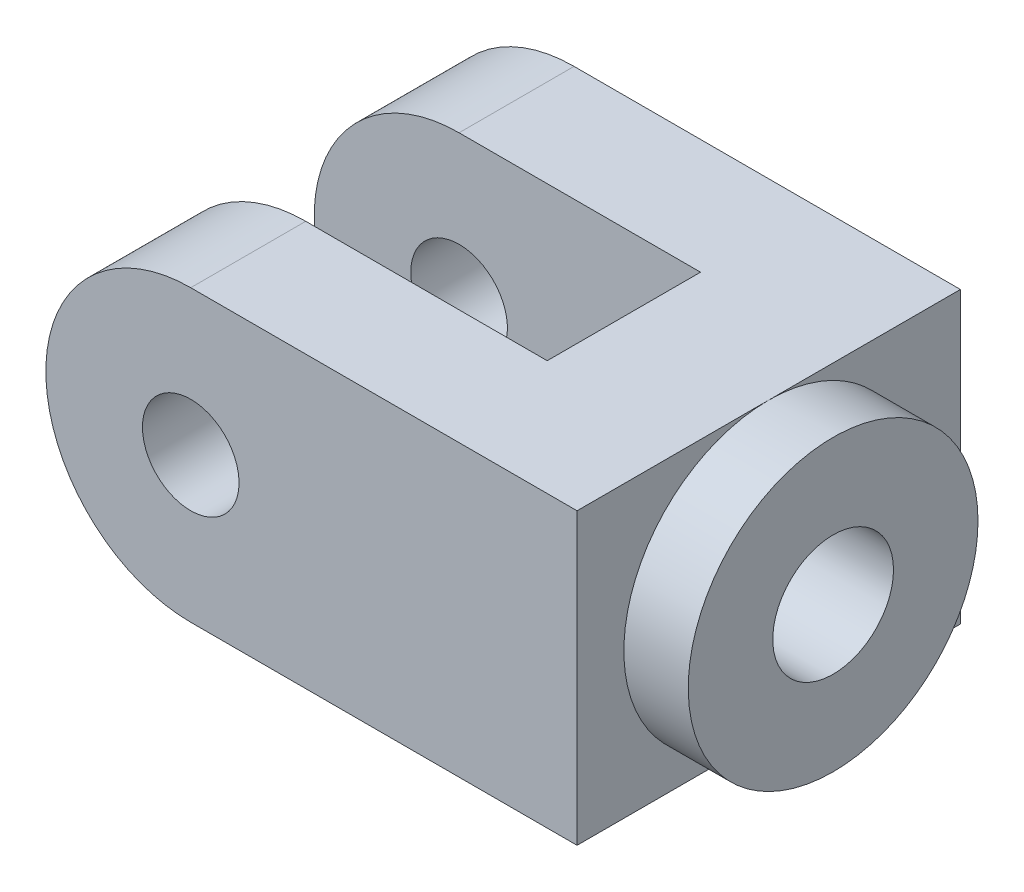
ISO-10303-21;
HEADER;
FILE_DESCRIPTION(('STEP AP214'),'2;1');
FILE_NAME('part.step','',(''),(''),'','','');
FILE_SCHEMA(('AUTOMOTIVE_DESIGN { 1 0 10303 214 1 1 1 1 }'));
ENDSEC;
DATA;
#1=APPLICATION_CONTEXT('core data for automotive mechanical design processes');
#2=APPLICATION_PROTOCOL_DEFINITION('international standard','automotive_design',2000,#1);
#3=PRODUCT_CONTEXT('',#1,'mechanical');
#4=PRODUCT('Part','Part','',(#3));
#5=PRODUCT_RELATED_PRODUCT_CATEGORY('part','',(#4));
#6=PRODUCT_DEFINITION_FORMATION('','',#4);
#7=PRODUCT_DEFINITION_CONTEXT('part definition',#1,'design');
#8=PRODUCT_DEFINITION('design','',#6,#7);
#9=PRODUCT_DEFINITION_SHAPE('','',#8);
#10=(LENGTH_UNIT() NAMED_UNIT(*) SI_UNIT(.MILLI.,.METRE.));
#11=(NAMED_UNIT(*) PLANE_ANGLE_UNIT() SI_UNIT($,.RADIAN.));
#12=(NAMED_UNIT(*) SI_UNIT($,.STERADIAN.) SOLID_ANGLE_UNIT());
#13=UNCERTAINTY_MEASURE_WITH_UNIT(LENGTH_MEASURE(1.E-05),#10,'distance_accuracy_value','');
#14=(GEOMETRIC_REPRESENTATION_CONTEXT(3) GLOBAL_UNCERTAINTY_ASSIGNED_CONTEXT((#13)) GLOBAL_UNIT_ASSIGNED_CONTEXT((#10,
#11,#12)) REPRESENTATION_CONTEXT('',''));
#15=CARTESIAN_POINT('',(0.,0.,0.));
#16=DIRECTION('',(0.,0.,1.));
#17=DIRECTION('',(1.,0.,0.));
#18=AXIS2_PLACEMENT_3D('',#15,#16,#17);
#19=CARTESIAN_POINT('',(66.,-36.,47.625));
#20=DIRECTION('',(-1.,0.,0.));
#21=DIRECTION('',(0.,0.,1.));
#22=AXIS2_PLACEMENT_3D('',#19,#20,#21);
#23=PLANE('',#22);
#24=CARTESIAN_POINT('',(66.,0.,0.));
#25=DIRECTION('',(1.,0.,0.));
#26=DIRECTION('',(0.,0.,-1.));
#27=AXIS2_PLACEMENT_3D('',#24,#25,#26);
#28=CIRCLE('',#27,36.);
#29=CARTESIAN_POINT('',(66.,36.,0.));
#30=VERTEX_POINT('',#29);
#31=CARTESIAN_POINT('',(66.,-36.,0.));
#32=VERTEX_POINT('',#31);
#33=EDGE_CURVE('E44',#30,#32,#28,.T.);
#34=ORIENTED_EDGE('',*,*,#33,.F.);
#35=DIRECTION('',(0.,0.,-1.));
#36=VECTOR('',#35,1.);
#37=CARTESIAN_POINT('',(66.,36.,47.625));
#38=LINE('',#37,#36);
#39=CARTESIAN_POINT('',(66.,36.,47.625));
#40=VERTEX_POINT('',#39);
#41=EDGE_CURVE('E107',#40,#30,#38,.T.);
#42=ORIENTED_EDGE('',*,*,#41,.F.);
#43=DIRECTION('',(0.,1.,0.));
#44=VECTOR('',#43,1.);
#45=CARTESIAN_POINT('',(66.,-36.,47.625));
#46=LINE('',#45,#44);
#47=CARTESIAN_POINT('',(66.,-36.,47.625));
#48=VERTEX_POINT('',#47);
#49=EDGE_CURVE('E190',#48,#40,#46,.T.);
#50=ORIENTED_EDGE('',*,*,#49,.F.);
#51=DIRECTION('',(0.,0.,-1.));
#52=VECTOR('',#51,1.);
#53=CARTESIAN_POINT('',(66.,-36.,47.625));
#54=LINE('',#53,#52);
#55=EDGE_CURVE('E128',#48,#32,#54,.T.);
#56=ORIENTED_EDGE('',*,*,#55,.T.);
#57=EDGE_LOOP('',(#34,#42,#50,#56));
#58=FACE_BOUND('',#57,.T.);
#59=ADVANCED_FACE('F33',(#58),#23,.F.);
#60=CARTESIAN_POINT('',(-30.,0.,389.175429799012));
#61=DIRECTION('',(0.,0.,-1.));
#62=DIRECTION('',(-1.,0.,0.));
#63=AXIS2_PLACEMENT_3D('',#60,#61,#62);
#64=CYLINDRICAL_SURFACE('',#63,36.);
#65=DIRECTION('',(0.,0.,-1.));
#66=VECTOR('',#65,1.);
#67=CARTESIAN_POINT('',(-30.,36.,389.175429799012));
#68=LINE('',#67,#66);
#69=CARTESIAN_POINT('',(-30.,36.,47.625));
#70=VERTEX_POINT('',#69);
#71=CARTESIAN_POINT('',(-30.,36.,19.045));
#72=VERTEX_POINT('',#71);
#73=EDGE_CURVE('E182',#70,#72,#68,.T.);
#74=ORIENTED_EDGE('',*,*,#73,.T.);
#75=CARTESIAN_POINT('',(-30.,0.,19.045));
#76=DIRECTION('',(0.,0.,1.));
#77=DIRECTION('',(1.,0.,0.));
#78=AXIS2_PLACEMENT_3D('',#75,#76,#77);
#79=CIRCLE('',#78,36.);
#80=CARTESIAN_POINT('',(-30.,-36.,19.045));
#81=VERTEX_POINT('',#80);
#82=EDGE_CURVE('E42',#72,#81,#79,.T.);
#83=ORIENTED_EDGE('',*,*,#82,.T.);
#84=DIRECTION('',(0.,0.,-1.));
#85=VECTOR('',#84,1.);
#86=CARTESIAN_POINT('',(-30.0000015084443,-36.,389.175429799012));
#87=LINE('',#86,#85);
#88=CARTESIAN_POINT('',(-30.0000015084443,-36.,47.625));
#89=VERTEX_POINT('',#88);
#90=EDGE_CURVE('E171',#89,#81,#87,.T.);
#91=ORIENTED_EDGE('',*,*,#90,.F.);
#92=CARTESIAN_POINT('',(-30.,0.,47.625));
#93=DIRECTION('',(0.,0.,1.));
#94=DIRECTION('',(1.,0.,0.));
#95=AXIS2_PLACEMENT_3D('',#92,#93,#94);
#96=CIRCLE('',#95,36.);
#97=EDGE_CURVE('E177',#89,#70,#96,.F.);
#98=ORIENTED_EDGE('',*,*,#97,.T.);
#99=EDGE_LOOP('',(#74,#83,#91,#98));
#100=FACE_BOUND('',#99,.T.);
#101=ADVANCED_FACE('F151',(#100),#64,.T.);
#102=CARTESIAN_POINT('',(66.,-36.,47.625));
#103=DIRECTION('',(0.,1.,0.));
#104=DIRECTION('',(-1.,0.,0.));
#105=AXIS2_PLACEMENT_3D('',#102,#103,#104);
#106=PLANE('',#105);
#107=ORIENTED_EDGE('',*,*,#90,.T.);
#108=DIRECTION('',(1.,0.,0.));
#109=VECTOR('',#108,1.);
#110=CARTESIAN_POINT('',(30.,-36.,19.045));
#111=LINE('',#110,#109);
#112=CARTESIAN_POINT('',(30.,-36.,19.045));
#113=VERTEX_POINT('',#112);
#114=EDGE_CURVE('E173',#81,#113,#111,.T.);
#115=ORIENTED_EDGE('',*,*,#114,.T.);
#116=DIRECTION('',(0.,0.,-1.));
#117=VECTOR('',#116,1.);
#118=CARTESIAN_POINT('',(30.,-36.,-19.055));
#119=LINE('',#118,#117);
#120=CARTESIAN_POINT('',(30.,-36.,-19.055));
#121=VERTEX_POINT('',#120);
#122=EDGE_CURVE('E216',#113,#121,#119,.T.);
#123=ORIENTED_EDGE('',*,*,#122,.T.);
#124=DIRECTION('',(-1.,0.,0.));
#125=VECTOR('',#124,1.);
#126=CARTESIAN_POINT('',(30.,-36.,-19.055));
#127=LINE('',#126,#125);
#128=CARTESIAN_POINT('',(-30.,-36.,-19.055));
#129=VERTEX_POINT('',#128);
#130=EDGE_CURVE('E218',#121,#129,#127,.T.);
#131=ORIENTED_EDGE('',*,*,#130,.T.);
#132=CARTESIAN_POINT('',(-30.0000015084443,-36.,-47.625));
#133=VERTEX_POINT('',#132);
#134=EDGE_CURVE('E178',#129,#133,#87,.T.);
#135=ORIENTED_EDGE('',*,*,#134,.T.);
#136=DIRECTION('',(1.,0.,0.));
#137=VECTOR('',#136,1.);
#138=CARTESIAN_POINT('',(66.,-36.,-47.625));
#139=LINE('',#138,#137);
#140=CARTESIAN_POINT('',(66.,-36.,-47.625));
#141=VERTEX_POINT('',#140);
#142=EDGE_CURVE('E180',#133,#141,#139,.T.);
#143=ORIENTED_EDGE('',*,*,#142,.T.);
#144=EDGE_CURVE('E119',#32,#141,#54,.T.);
#145=ORIENTED_EDGE('',*,*,#144,.F.);
#146=ORIENTED_EDGE('',*,*,#55,.F.);
#147=DIRECTION('',(1.,0.,0.));
#148=VECTOR('',#147,1.);
#149=CARTESIAN_POINT('',(66.,-36.,47.625));
#150=LINE('',#149,#148);
#151=EDGE_CURVE('E174',#89,#48,#150,.T.);
#152=ORIENTED_EDGE('',*,*,#151,.F.);
#153=EDGE_LOOP('',(#107,#115,#123,#131,#135,#143,#145,#146,#152));
#154=FACE_BOUND('',#153,.T.);
#155=ADVANCED_FACE('F35',(#154),#106,.F.);
#156=EDGE_CURVE('E11',#32,#30,#28,.T.);
#157=ORIENTED_EDGE('',*,*,#156,.F.);
#158=ORIENTED_EDGE('',*,*,#144,.T.);
#159=DIRECTION('',(0.,1.,0.));
#160=VECTOR('',#159,1.);
#161=CARTESIAN_POINT('',(66.,-36.,-47.625));
#162=LINE('',#161,#160);
#163=CARTESIAN_POINT('',(66.,36.,-47.625));
#164=VERTEX_POINT('',#163);
#165=EDGE_CURVE('E123',#141,#164,#162,.T.);
#166=ORIENTED_EDGE('',*,*,#165,.T.);
#167=EDGE_CURVE('E111',#30,#164,#38,.T.);
#168=ORIENTED_EDGE('',*,*,#167,.F.);
#169=EDGE_LOOP('',(#157,#158,#166,#168));
#170=FACE_BOUND('',#169,.T.);
#171=ADVANCED_FACE('F121',(#170),#23,.F.);
#172=CARTESIAN_POINT('',(66.,36.,47.625));
#173=DIRECTION('',(0.,-1.,0.));
#174=DIRECTION('',(1.,0.,0.));
#175=AXIS2_PLACEMENT_3D('',#172,#173,#174);
#176=PLANE('',#175);
#177=DIRECTION('',(0.,0.,-1.));
#178=VECTOR('',#177,1.);
#179=CARTESIAN_POINT('',(30.,36.,-19.055));
#180=LINE('',#179,#178);
#181=CARTESIAN_POINT('',(30.,36.,19.045));
#182=VERTEX_POINT('',#181);
#183=CARTESIAN_POINT('',(30.,36.,-19.055));
#184=VERTEX_POINT('',#183);
#185=EDGE_CURVE('E205',#182,#184,#180,.T.);
#186=ORIENTED_EDGE('',*,*,#185,.F.);
#187=DIRECTION('',(1.,0.,0.));
#188=VECTOR('',#187,1.);
#189=CARTESIAN_POINT('',(30.,36.,19.045));
#190=LINE('',#189,#188);
#191=EDGE_CURVE('E219',#72,#182,#190,.T.);
#192=ORIENTED_EDGE('',*,*,#191,.F.);
#193=ORIENTED_EDGE('',*,*,#73,.F.);
#194=DIRECTION('',(-1.,0.,0.));
#195=VECTOR('',#194,1.);
#196=CARTESIAN_POINT('',(66.,36.,47.625));
#197=LINE('',#196,#195);
#198=EDGE_CURVE('E115',#40,#70,#197,.T.);
#199=ORIENTED_EDGE('',*,*,#198,.F.);
#200=ORIENTED_EDGE('',*,*,#41,.T.);
#201=ORIENTED_EDGE('',*,*,#167,.T.);
#202=DIRECTION('',(-1.,0.,0.));
#203=VECTOR('',#202,1.);
#204=CARTESIAN_POINT('',(66.,36.,-47.625));
#205=LINE('',#204,#203);
#206=CARTESIAN_POINT('',(-30.,36.,-47.625));
#207=VERTEX_POINT('',#206);
#208=EDGE_CURVE('E191',#164,#207,#205,.T.);
#209=ORIENTED_EDGE('',*,*,#208,.T.);
#210=CARTESIAN_POINT('',(-30.,36.,-19.055));
#211=VERTEX_POINT('',#210);
#212=EDGE_CURVE('E57',#211,#207,#68,.T.);
#213=ORIENTED_EDGE('',*,*,#212,.F.);
#214=DIRECTION('',(-1.,0.,0.));
#215=VECTOR('',#214,1.);
#216=CARTESIAN_POINT('',(30.,36.,-19.055));
#217=LINE('',#216,#215);
#218=EDGE_CURVE('E209',#184,#211,#217,.T.);
#219=ORIENTED_EDGE('',*,*,#218,.F.);
#220=EDGE_LOOP('',(#186,#192,#193,#199,#200,#201,#209,#213,#219));
#221=FACE_BOUND('',#220,.T.);
#222=ADVANCED_FACE('F109',(#221),#176,.F.);
#223=CARTESIAN_POINT('',(0.,0.,47.625));
#224=DIRECTION('',(0.,0.,1.));
#225=DIRECTION('',(1.,0.,0.));
#226=AXIS2_PLACEMENT_3D('',#223,#224,#225);
#227=PLANE('',#226);
#228=CARTESIAN_POINT('',(-30.,0.,47.625));
#229=DIRECTION('',(0.,0.,-1.));
#230=DIRECTION('',(-1.,0.,0.));
#231=AXIS2_PLACEMENT_3D('',#228,#229,#230);
#232=CIRCLE('',#231,12.);
#233=CARTESIAN_POINT('',(-42.,0.,47.625));
#234=VERTEX_POINT('',#233);
#235=EDGE_CURVE('E265',#234,#234,#232,.T.);
#236=ORIENTED_EDGE('',*,*,#235,.T.);
#237=EDGE_LOOP('',(#236));
#238=FACE_BOUND('',#237,.T.);
#239=ORIENTED_EDGE('',*,*,#97,.F.);
#240=ORIENTED_EDGE('',*,*,#151,.T.);
#241=ORIENTED_EDGE('',*,*,#49,.T.);
#242=ORIENTED_EDGE('',*,*,#198,.T.);
#243=EDGE_LOOP('',(#239,#240,#241,#242));
#244=FACE_BOUND('',#243,.T.);
#245=ADVANCED_FACE('F164',(#238,#244),#227,.T.);
#246=CARTESIAN_POINT('',(0.,0.,-47.625));
#247=DIRECTION('',(0.,0.,1.));
#248=DIRECTION('',(1.,0.,0.));
#249=AXIS2_PLACEMENT_3D('',#246,#247,#248);
#250=PLANE('',#249);
#251=CARTESIAN_POINT('',(-30.,0.,-47.625));
#252=DIRECTION('',(0.,0.,-1.));
#253=DIRECTION('',(-1.,0.,0.));
#254=AXIS2_PLACEMENT_3D('',#251,#252,#253);
#255=CIRCLE('',#254,12.);
#256=CARTESIAN_POINT('',(-42.,0.,-47.625));
#257=VERTEX_POINT('',#256);
#258=EDGE_CURVE('E264',#257,#257,#255,.T.);
#259=ORIENTED_EDGE('',*,*,#258,.F.);
#260=EDGE_LOOP('',(#259));
#261=FACE_BOUND('',#260,.T.);
#262=ORIENTED_EDGE('',*,*,#142,.F.);
#263=CARTESIAN_POINT('',(-30.,0.,-47.625));
#264=DIRECTION('',(0.,0.,1.));
#265=DIRECTION('',(1.,0.,0.));
#266=AXIS2_PLACEMENT_3D('',#263,#264,#265);
#267=CIRCLE('',#266,36.);
#268=EDGE_CURVE('E199',#133,#207,#267,.F.);
#269=ORIENTED_EDGE('',*,*,#268,.T.);
#270=ORIENTED_EDGE('',*,*,#208,.F.);
#271=ORIENTED_EDGE('',*,*,#165,.F.);
#272=EDGE_LOOP('',(#262,#269,#270,#271));
#273=FACE_BOUND('',#272,.T.);
#274=ADVANCED_FACE('F237',(#261,#273),#250,.F.);
#275=CARTESIAN_POINT('',(-30.,0.,-19.055));
#276=DIRECTION('',(0.,0.,-1.));
#277=DIRECTION('',(-1.,0.,0.));
#278=AXIS2_PLACEMENT_3D('',#275,#276,#277);
#279=CIRCLE('',#278,36.);
#280=EDGE_CURVE('E201',#129,#211,#279,.T.);
#281=ORIENTED_EDGE('',*,*,#280,.T.);
#282=ORIENTED_EDGE('',*,*,#212,.T.);
#283=ORIENTED_EDGE('',*,*,#268,.F.);
#284=ORIENTED_EDGE('',*,*,#134,.F.);
#285=EDGE_LOOP('',(#281,#282,#283,#284));
#286=FACE_BOUND('',#285,.T.);
#287=ADVANCED_FACE('F157',(#286),#64,.T.);
#288=CARTESIAN_POINT('',(30.,-36.,19.045));
#289=DIRECTION('',(0.,0.,1.));
#290=DIRECTION('',(1.,0.,0.));
#291=AXIS2_PLACEMENT_3D('',#288,#289,#290);
#292=PLANE('',#291);
#293=CARTESIAN_POINT('',(-30.,0.,19.045));
#294=DIRECTION('',(0.,0.,1.));
#295=DIRECTION('',(1.,0.,0.));
#296=AXIS2_PLACEMENT_3D('',#293,#294,#295);
#297=CIRCLE('',#296,12.);
#298=CARTESIAN_POINT('',(-18.,0.,19.045));
#299=VERTEX_POINT('',#298);
#300=EDGE_CURVE('E269',#299,#299,#297,.T.);
#301=ORIENTED_EDGE('',*,*,#300,.T.);
#302=EDGE_LOOP('',(#301));
#303=FACE_BOUND('',#302,.T.);
#304=ORIENTED_EDGE('',*,*,#191,.T.);
#305=DIRECTION('',(0.,1.,0.));
#306=VECTOR('',#305,1.);
#307=CARTESIAN_POINT('',(30.,-36.,19.045));
#308=LINE('',#307,#306);
#309=EDGE_CURVE('E225',#113,#182,#308,.T.);
#310=ORIENTED_EDGE('',*,*,#309,.F.);
#311=ORIENTED_EDGE('',*,*,#114,.F.);
#312=ORIENTED_EDGE('',*,*,#82,.F.);
#313=EDGE_LOOP('',(#304,#310,#311,#312));
#314=FACE_BOUND('',#313,.T.);
#315=ADVANCED_FACE('F241',(#303,#314),#292,.F.);
#316=CARTESIAN_POINT('',(30.,-36.,-19.055));
#317=DIRECTION('',(0.,0.,-1.));
#318=DIRECTION('',(-1.,0.,0.));
#319=AXIS2_PLACEMENT_3D('',#316,#317,#318);
#320=PLANE('',#319);
#321=CARTESIAN_POINT('',(-30.,0.,-19.055));
#322=DIRECTION('',(0.,0.,-1.));
#323=DIRECTION('',(-1.,0.,0.));
#324=AXIS2_PLACEMENT_3D('',#321,#322,#323);
#325=CIRCLE('',#324,12.);
#326=CARTESIAN_POINT('',(-42.,0.,-19.055));
#327=VERTEX_POINT('',#326);
#328=EDGE_CURVE('E37',#327,#327,#325,.T.);
#329=ORIENTED_EDGE('',*,*,#328,.T.);
#330=EDGE_LOOP('',(#329));
#331=FACE_BOUND('',#330,.T.);
#332=ORIENTED_EDGE('',*,*,#280,.F.);
#333=ORIENTED_EDGE('',*,*,#130,.F.);
#334=DIRECTION('',(0.,1.,0.));
#335=VECTOR('',#334,1.);
#336=CARTESIAN_POINT('',(30.,-36.,-19.055));
#337=LINE('',#336,#335);
#338=EDGE_CURVE('E185',#121,#184,#337,.T.);
#339=ORIENTED_EDGE('',*,*,#338,.T.);
#340=ORIENTED_EDGE('',*,*,#218,.T.);
#341=EDGE_LOOP('',(#332,#333,#339,#340));
#342=FACE_BOUND('',#341,.T.);
#343=ADVANCED_FACE('F231',(#331,#342),#320,.F.);
#344=CARTESIAN_POINT('',(30.,-36.,-19.055));
#345=DIRECTION('',(1.,0.,0.));
#346=DIRECTION('',(0.,1.,0.));
#347=AXIS2_PLACEMENT_3D('',#344,#345,#346);
#348=PLANE('',#347);
#349=CARTESIAN_POINT('',(30.,0.,0.));
#350=DIRECTION('',(1.,0.,0.));
#351=DIRECTION('',(0.,1.,0.));
#352=AXIS2_PLACEMENT_3D('',#349,#350,#351);
#353=CIRCLE('',#352,15.);
#354=CARTESIAN_POINT('',(30.,15.,0.));
#355=VERTEX_POINT('',#354);
#356=EDGE_CURVE('E203',#355,#355,#353,.T.);
#357=ORIENTED_EDGE('',*,*,#356,.T.);
#358=EDGE_LOOP('',(#357));
#359=FACE_BOUND('',#358,.T.);
#360=ORIENTED_EDGE('',*,*,#185,.T.);
#361=ORIENTED_EDGE('',*,*,#338,.F.);
#362=ORIENTED_EDGE('',*,*,#122,.F.);
#363=ORIENTED_EDGE('',*,*,#309,.T.);
#364=EDGE_LOOP('',(#360,#361,#362,#363));
#365=FACE_BOUND('',#364,.T.);
#366=ADVANCED_FACE('F233',(#359,#365),#348,.F.);
#367=CARTESIAN_POINT('',(-66.,0.,0.));
#368=DIRECTION('',(1.,0.,0.));
#369=DIRECTION('',(0.,0.,-1.));
#370=AXIS2_PLACEMENT_3D('',#367,#368,#369);
#371=CYLINDRICAL_SURFACE('',#370,15.);
#372=ORIENTED_EDGE('',*,*,#356,.F.);
#373=EDGE_LOOP('',(#372));
#374=FACE_BOUND('',#373,.T.);
#375=CARTESIAN_POINT('',(82.,0.,0.));
#376=DIRECTION('',(1.,0.,0.));
#377=DIRECTION('',(0.,0.,-1.));
#378=AXIS2_PLACEMENT_3D('',#375,#376,#377);
#379=CIRCLE('',#378,15.);
#380=CARTESIAN_POINT('',(82.,0.,-15.));
#381=VERTEX_POINT('',#380);
#382=EDGE_CURVE('E131',#381,#381,#379,.T.);
#383=ORIENTED_EDGE('',*,*,#382,.T.);
#384=EDGE_LOOP('',(#383));
#385=FACE_BOUND('',#384,.T.);
#386=ADVANCED_FACE('F145',(#374,#385),#371,.F.);
#387=CARTESIAN_POINT('',(82.,0.,0.));
#388=DIRECTION('',(1.,0.,0.));
#389=DIRECTION('',(0.,0.,-1.));
#390=AXIS2_PLACEMENT_3D('',#387,#388,#389);
#391=PLANE('',#390);
#392=CARTESIAN_POINT('',(82.,0.,0.));
#393=DIRECTION('',(1.,0.,0.));
#394=DIRECTION('',(0.,0.,-1.));
#395=AXIS2_PLACEMENT_3D('',#392,#393,#394);
#396=CIRCLE('',#395,36.);
#397=CARTESIAN_POINT('',(82.,0.,-36.));
#398=VERTEX_POINT('',#397);
#399=EDGE_CURVE('E130',#398,#398,#396,.T.);
#400=ORIENTED_EDGE('',*,*,#399,.T.);
#401=EDGE_LOOP('',(#400));
#402=FACE_BOUND('',#401,.T.);
#403=ORIENTED_EDGE('',*,*,#382,.F.);
#404=EDGE_LOOP('',(#403));
#405=FACE_BOUND('',#404,.T.);
#406=ADVANCED_FACE('F135',(#402,#405),#391,.T.);
#407=CARTESIAN_POINT('',(82.,0.,0.));
#408=DIRECTION('',(-1.,0.,0.));
#409=DIRECTION('',(0.,0.,1.));
#410=AXIS2_PLACEMENT_3D('',#407,#408,#409);
#411=CYLINDRICAL_SURFACE('',#410,36.);
#412=ORIENTED_EDGE('',*,*,#399,.F.);
#413=EDGE_LOOP('',(#412));
#414=FACE_BOUND('',#413,.T.);
#415=ORIENTED_EDGE('',*,*,#33,.T.);
#416=ORIENTED_EDGE('',*,*,#156,.T.);
#417=EDGE_LOOP('',(#415,#416));
#418=FACE_BOUND('',#417,.T.);
#419=ADVANCED_FACE('F132',(#414,#418),#411,.T.);
#420=CARTESIAN_POINT('',(-30.,0.,47.625));
#421=DIRECTION('',(0.,0.,-1.));
#422=DIRECTION('',(-1.,0.,0.));
#423=AXIS2_PLACEMENT_3D('',#420,#421,#422);
#424=CYLINDRICAL_SURFACE('',#423,12.);
#425=ORIENTED_EDGE('',*,*,#258,.T.);
#426=EDGE_LOOP('',(#425));
#427=FACE_BOUND('',#426,.T.);
#428=ORIENTED_EDGE('',*,*,#328,.F.);
#429=EDGE_LOOP('',(#428));
#430=FACE_BOUND('',#429,.T.);
#431=ADVANCED_FACE('F134',(#427,#430),#424,.F.);
#432=ORIENTED_EDGE('',*,*,#235,.F.);
#433=EDGE_LOOP('',(#432));
#434=FACE_BOUND('',#433,.T.);
#435=ORIENTED_EDGE('',*,*,#300,.F.);
#436=EDGE_LOOP('',(#435));
#437=FACE_BOUND('',#436,.T.);
#438=ADVANCED_FACE('F142',(#434,#437),#424,.F.);
#439=CLOSED_SHELL('',(#59,#101,#155,#171,#222,#245,#274,#287,#315,#343,#366,#386,#406,#419,#431,#438));
#440=MANIFOLD_SOLID_BREP('B2',#439);
#441=ADVANCED_BREP_SHAPE_REPRESENTATION('',(#18,#440),#14);
#442=SHAPE_DEFINITION_REPRESENTATION(#9,#441);
ENDSEC;
END-ISO-10303-21;
